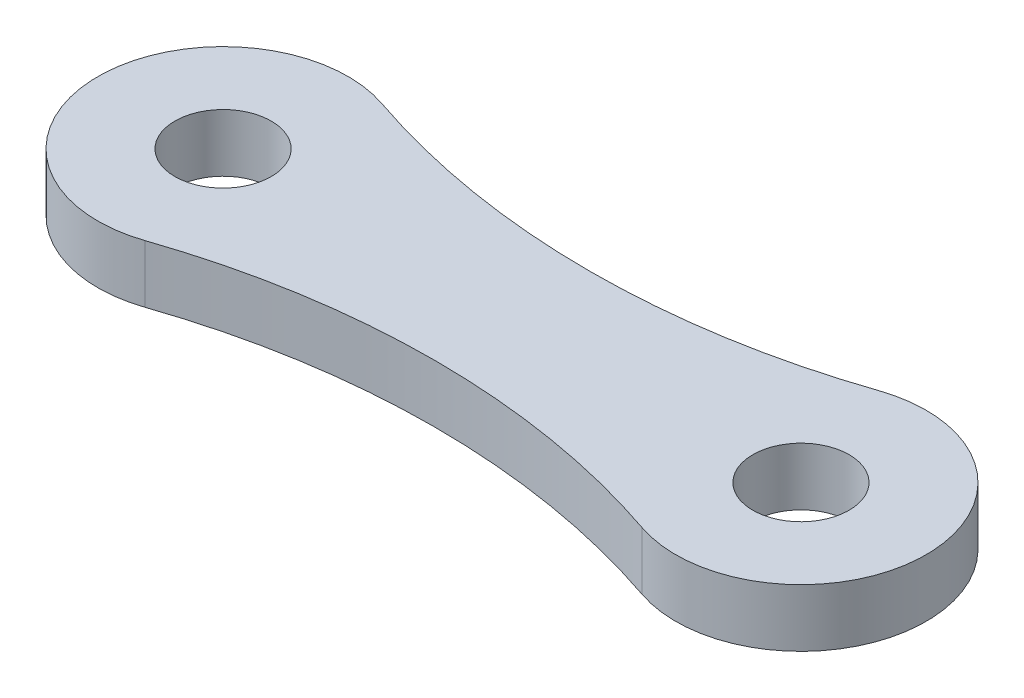
ISO-10303-21;
HEADER;
FILE_DESCRIPTION(('STEP AP214'),'2;1');
FILE_NAME('part.step','',(''),(''),'','','');
FILE_SCHEMA(('AUTOMOTIVE_DESIGN { 1 0 10303 214 1 1 1 1 }'));
ENDSEC;
DATA;
#1=APPLICATION_CONTEXT('core data for automotive mechanical design processes');
#2=APPLICATION_PROTOCOL_DEFINITION('international standard','automotive_design',2000,#1);
#3=PRODUCT_CONTEXT('',#1,'mechanical');
#4=PRODUCT('Part','Part','',(#3));
#5=PRODUCT_RELATED_PRODUCT_CATEGORY('part','',(#4));
#6=PRODUCT_DEFINITION_FORMATION('','',#4);
#7=PRODUCT_DEFINITION_CONTEXT('part definition',#1,'design');
#8=PRODUCT_DEFINITION('design','',#6,#7);
#9=PRODUCT_DEFINITION_SHAPE('','',#8);
#10=(LENGTH_UNIT() NAMED_UNIT(*) SI_UNIT(.MILLI.,.METRE.));
#11=(NAMED_UNIT(*) PLANE_ANGLE_UNIT() SI_UNIT($,.RADIAN.));
#12=(NAMED_UNIT(*) SI_UNIT($,.STERADIAN.) SOLID_ANGLE_UNIT());
#13=UNCERTAINTY_MEASURE_WITH_UNIT(LENGTH_MEASURE(1.E-05),#10,'distance_accuracy_value','');
#14=(GEOMETRIC_REPRESENTATION_CONTEXT(3) GLOBAL_UNCERTAINTY_ASSIGNED_CONTEXT((#13)) GLOBAL_UNIT_ASSIGNED_CONTEXT((#10,
#11,#12)) REPRESENTATION_CONTEXT('',''));
#15=CARTESIAN_POINT('',(0.,0.,0.));
#16=DIRECTION('',(0.,0.,1.));
#17=DIRECTION('',(1.,0.,0.));
#18=AXIS2_PLACEMENT_3D('',#15,#16,#17);
#19=CARTESIAN_POINT('',(7.49999999999954,3.,-22.0071011266819));
#20=DIRECTION('',(0.,1.,0.));
#21=DIRECTION('',(0.,0.,1.));
#22=AXIS2_PLACEMENT_3D('',#19,#20,#21);
#23=PLANE('',#22);
#24=CARTESIAN_POINT('',(-15.,3.,0.));
#25=DIRECTION('',(0.,1.,0.));
#26=DIRECTION('',(0.,0.,1.));
#27=AXIS2_PLACEMENT_3D('',#24,#25,#26);
#28=CIRCLE('',#27,2.5);
#29=CARTESIAN_POINT('',(-15.,3.,2.5));
#30=VERTEX_POINT('',#29);
#31=EDGE_CURVE('E104',#30,#30,#28,.T.);
#32=ORIENTED_EDGE('',*,*,#31,.F.);
#33=EDGE_LOOP('',(#32));
#34=FACE_BOUND('',#33,.T.);
#35=CARTESIAN_POINT('',(-9.16473674324677E-13,3.,-44.0142022533639));
#36=DIRECTION('',(0.,-1.,0.));
#37=DIRECTION('',(0.,0.,1.));
#38=AXIS2_PLACEMENT_3D('',#35,#36,#37);
#39=CIRCLE('',#38,40.0000000000001);
#40=CARTESIAN_POINT('',(12.9032258064513,3.,-6.1525228956316));
#41=VERTEX_POINT('',#40);
#42=CARTESIAN_POINT('',(-12.9032258064517,3.,-6.15252289563152));
#43=VERTEX_POINT('',#42);
#44=EDGE_CURVE('E89',#41,#43,#39,.T.);
#45=ORIENTED_EDGE('',*,*,#44,.T.);
#46=CARTESIAN_POINT('',(-15.,3.,0.));
#47=DIRECTION('',(0.,1.,0.));
#48=DIRECTION('',(0.,0.,1.));
#49=AXIS2_PLACEMENT_3D('',#46,#47,#48);
#50=CIRCLE('',#49,6.5);
#51=CARTESIAN_POINT('',(-12.9032258064517,3.,6.15252289563152));
#52=VERTEX_POINT('',#51);
#53=EDGE_CURVE('E84',#43,#52,#50,.T.);
#54=ORIENTED_EDGE('',*,*,#53,.T.);
#55=CARTESIAN_POINT('',(-9.16473674324677E-13,3.,44.0142022533639));
#56=DIRECTION('',(0.,-1.,0.));
#57=DIRECTION('',(0.,0.,-1.));
#58=AXIS2_PLACEMENT_3D('',#55,#56,#57);
#59=CIRCLE('',#58,40.0000000000001);
#60=CARTESIAN_POINT('',(12.9032258064512,3.,6.15252289563186));
#61=VERTEX_POINT('',#60);
#62=EDGE_CURVE('E87',#52,#61,#59,.T.);
#63=ORIENTED_EDGE('',*,*,#62,.T.);
#64=CARTESIAN_POINT('',(15.,3.,1.93890881133645E-13));
#65=DIRECTION('',(0.,1.,0.));
#66=DIRECTION('',(0.,0.,-1.));
#67=AXIS2_PLACEMENT_3D('',#64,#65,#66);
#68=CIRCLE('',#67,6.50000000000042);
#69=EDGE_CURVE('E54',#61,#41,#68,.T.);
#70=ORIENTED_EDGE('',*,*,#69,.T.);
#71=EDGE_LOOP('',(#45,#54,#63,#70));
#72=FACE_BOUND('',#71,.T.);
#73=CARTESIAN_POINT('',(15.,3.,1.93890881133645E-13));
#74=DIRECTION('',(0.,1.,0.));
#75=DIRECTION('',(0.,0.,-1.));
#76=AXIS2_PLACEMENT_3D('',#73,#74,#75);
#77=CIRCLE('',#76,2.5);
#78=CARTESIAN_POINT('',(15.,3.,-2.49999999999981));
#79=VERTEX_POINT('',#78);
#80=EDGE_CURVE('E119',#79,#79,#77,.T.);
#81=ORIENTED_EDGE('',*,*,#80,.F.);
#82=EDGE_LOOP('',(#81));
#83=FACE_BOUND('',#82,.T.);
#84=ADVANCED_FACE('F37',(#34,#72,#83),#23,.T.);
#85=CARTESIAN_POINT('',(7.49999999999954,0.,-22.0071011266819));
#86=DIRECTION('',(0.,1.,0.));
#87=DIRECTION('',(0.,0.,1.));
#88=AXIS2_PLACEMENT_3D('',#85,#86,#87);
#89=PLANE('',#88);
#90=CARTESIAN_POINT('',(-9.16473674324677E-13,0.,-44.0142022533639));
#91=DIRECTION('',(0.,-1.,0.));
#92=DIRECTION('',(0.,0.,1.));
#93=AXIS2_PLACEMENT_3D('',#90,#91,#92);
#94=CIRCLE('',#93,40.0000000000001);
#95=CARTESIAN_POINT('',(12.9032258064513,0.,-6.1525228956316));
#96=VERTEX_POINT('',#95);
#97=CARTESIAN_POINT('',(-12.9032258064517,0.,-6.15252289563152));
#98=VERTEX_POINT('',#97);
#99=EDGE_CURVE('E101',#96,#98,#94,.T.);
#100=ORIENTED_EDGE('',*,*,#99,.F.);
#101=CARTESIAN_POINT('',(15.,0.,1.93890881133645E-13));
#102=DIRECTION('',(0.,1.,0.));
#103=DIRECTION('',(0.,0.,-1.));
#104=AXIS2_PLACEMENT_3D('',#101,#102,#103);
#105=CIRCLE('',#104,6.50000000000042);
#106=CARTESIAN_POINT('',(12.9032258064512,0.,6.15252289563186));
#107=VERTEX_POINT('',#106);
#108=EDGE_CURVE('E77',#107,#96,#105,.T.);
#109=ORIENTED_EDGE('',*,*,#108,.F.);
#110=CARTESIAN_POINT('',(-9.16473674324677E-13,0.,44.0142022533639));
#111=DIRECTION('',(0.,-1.,0.));
#112=DIRECTION('',(0.,0.,-1.));
#113=AXIS2_PLACEMENT_3D('',#110,#111,#112);
#114=CIRCLE('',#113,40.0000000000001);
#115=CARTESIAN_POINT('',(-12.9032258064517,0.,6.15252289563152));
#116=VERTEX_POINT('',#115);
#117=EDGE_CURVE('E71',#116,#107,#114,.T.);
#118=ORIENTED_EDGE('',*,*,#117,.F.);
#119=CARTESIAN_POINT('',(-15.,0.,0.));
#120=DIRECTION('',(0.,1.,0.));
#121=DIRECTION('',(0.,0.,1.));
#122=AXIS2_PLACEMENT_3D('',#119,#120,#121);
#123=CIRCLE('',#122,6.5);
#124=EDGE_CURVE('E93',#98,#116,#123,.T.);
#125=ORIENTED_EDGE('',*,*,#124,.F.);
#126=EDGE_LOOP('',(#100,#109,#118,#125));
#127=FACE_BOUND('',#126,.T.);
#128=CARTESIAN_POINT('',(-15.,0.,0.));
#129=DIRECTION('',(0.,1.,0.));
#130=DIRECTION('',(0.,0.,1.));
#131=AXIS2_PLACEMENT_3D('',#128,#129,#130);
#132=CIRCLE('',#131,2.5);
#133=CARTESIAN_POINT('',(-15.,0.,2.5));
#134=VERTEX_POINT('',#133);
#135=EDGE_CURVE('E116',#134,#134,#132,.T.);
#136=ORIENTED_EDGE('',*,*,#135,.T.);
#137=EDGE_LOOP('',(#136));
#138=FACE_BOUND('',#137,.T.);
#139=CARTESIAN_POINT('',(15.,0.,1.93890881133645E-13));
#140=DIRECTION('',(0.,1.,0.));
#141=DIRECTION('',(0.,0.,-1.));
#142=AXIS2_PLACEMENT_3D('',#139,#140,#141);
#143=CIRCLE('',#142,2.5);
#144=CARTESIAN_POINT('',(15.,0.,-2.49999999999981));
#145=VERTEX_POINT('',#144);
#146=EDGE_CURVE('E122',#145,#145,#143,.T.);
#147=ORIENTED_EDGE('',*,*,#146,.T.);
#148=EDGE_LOOP('',(#147));
#149=FACE_BOUND('',#148,.T.);
#150=ADVANCED_FACE('F112',(#127,#138,#149),#89,.F.);
#151=CARTESIAN_POINT('',(-9.16473674324677E-13,3.,-44.0142022533639));
#152=DIRECTION('',(0.,-1.,0.));
#153=DIRECTION('',(0.,0.,-1.));
#154=AXIS2_PLACEMENT_3D('',#151,#152,#153);
#155=CYLINDRICAL_SURFACE('',#154,40.0000000000001);
#156=ORIENTED_EDGE('',*,*,#99,.T.);
#157=DIRECTION('',(0.,-1.,0.));
#158=VECTOR('',#157,1.);
#159=CARTESIAN_POINT('',(-12.9032258064517,3.,-6.15252289563152));
#160=LINE('',#159,#158);
#161=EDGE_CURVE('E11',#43,#98,#160,.T.);
#162=ORIENTED_EDGE('',*,*,#161,.F.);
#163=ORIENTED_EDGE('',*,*,#44,.F.);
#164=DIRECTION('',(0.,-1.,0.));
#165=VECTOR('',#164,1.);
#166=CARTESIAN_POINT('',(12.9032258064513,3.,-6.1525228956316));
#167=LINE('',#166,#165);
#168=EDGE_CURVE('E97',#41,#96,#167,.T.);
#169=ORIENTED_EDGE('',*,*,#168,.T.);
#170=EDGE_LOOP('',(#156,#162,#163,#169));
#171=FACE_BOUND('',#170,.T.);
#172=ADVANCED_FACE('F39',(#171),#155,.F.);
#173=CARTESIAN_POINT('',(-15.,3.,0.));
#174=DIRECTION('',(0.,-1.,0.));
#175=DIRECTION('',(0.,0.,-1.));
#176=AXIS2_PLACEMENT_3D('',#173,#174,#175);
#177=CYLINDRICAL_SURFACE('',#176,6.5);
#178=ORIENTED_EDGE('',*,*,#124,.T.);
#179=DIRECTION('',(0.,-1.,0.));
#180=VECTOR('',#179,1.);
#181=CARTESIAN_POINT('',(-12.9032258064517,3.,6.15252289563152));
#182=LINE('',#181,#180);
#183=EDGE_CURVE('E46',#52,#116,#182,.T.);
#184=ORIENTED_EDGE('',*,*,#183,.F.);
#185=ORIENTED_EDGE('',*,*,#53,.F.);
#186=ORIENTED_EDGE('',*,*,#161,.T.);
#187=EDGE_LOOP('',(#178,#184,#185,#186));
#188=FACE_BOUND('',#187,.T.);
#189=ADVANCED_FACE('F92',(#188),#177,.T.);
#190=CARTESIAN_POINT('',(-9.16473674324677E-13,3.,44.0142022533639));
#191=DIRECTION('',(0.,-1.,0.));
#192=DIRECTION('',(0.,0.,-1.));
#193=AXIS2_PLACEMENT_3D('',#190,#191,#192);
#194=CYLINDRICAL_SURFACE('',#193,40.0000000000001);
#195=ORIENTED_EDGE('',*,*,#117,.T.);
#196=DIRECTION('',(0.,-1.,0.));
#197=VECTOR('',#196,1.);
#198=CARTESIAN_POINT('',(12.9032258064512,3.,6.15252289563186));
#199=LINE('',#198,#197);
#200=EDGE_CURVE('E94',#61,#107,#199,.T.);
#201=ORIENTED_EDGE('',*,*,#200,.F.);
#202=ORIENTED_EDGE('',*,*,#62,.F.);
#203=ORIENTED_EDGE('',*,*,#183,.T.);
#204=EDGE_LOOP('',(#195,#201,#202,#203));
#205=FACE_BOUND('',#204,.T.);
#206=ADVANCED_FACE('F95',(#205),#194,.F.);
#207=CARTESIAN_POINT('',(15.,3.,1.93890881133645E-13));
#208=DIRECTION('',(0.,-1.,0.));
#209=DIRECTION('',(0.,0.,-1.));
#210=AXIS2_PLACEMENT_3D('',#207,#208,#209);
#211=CYLINDRICAL_SURFACE('',#210,6.50000000000042);
#212=ORIENTED_EDGE('',*,*,#108,.T.);
#213=ORIENTED_EDGE('',*,*,#168,.F.);
#214=ORIENTED_EDGE('',*,*,#69,.F.);
#215=ORIENTED_EDGE('',*,*,#200,.T.);
#216=EDGE_LOOP('',(#212,#213,#214,#215));
#217=FACE_BOUND('',#216,.T.);
#218=ADVANCED_FACE('F109',(#217),#211,.T.);
#219=CARTESIAN_POINT('',(-15.,3.,0.));
#220=DIRECTION('',(0.,-1.,0.));
#221=DIRECTION('',(0.,0.,-1.));
#222=AXIS2_PLACEMENT_3D('',#219,#220,#221);
#223=CYLINDRICAL_SURFACE('',#222,2.5);
#224=ORIENTED_EDGE('',*,*,#31,.T.);
#225=EDGE_LOOP('',(#224));
#226=FACE_BOUND('',#225,.T.);
#227=ORIENTED_EDGE('',*,*,#135,.F.);
#228=EDGE_LOOP('',(#227));
#229=FACE_BOUND('',#228,.T.);
#230=ADVANCED_FACE('F139',(#226,#229),#223,.F.);
#231=CARTESIAN_POINT('',(15.,3.,1.93890881133645E-13));
#232=DIRECTION('',(0.,-1.,0.));
#233=DIRECTION('',(0.,0.,-1.));
#234=AXIS2_PLACEMENT_3D('',#231,#232,#233);
#235=CYLINDRICAL_SURFACE('',#234,2.5);
#236=ORIENTED_EDGE('',*,*,#80,.T.);
#237=EDGE_LOOP('',(#236));
#238=FACE_BOUND('',#237,.T.);
#239=ORIENTED_EDGE('',*,*,#146,.F.);
#240=EDGE_LOOP('',(#239));
#241=FACE_BOUND('',#240,.T.);
#242=ADVANCED_FACE('F128',(#238,#241),#235,.F.);
#243=CLOSED_SHELL('',(#84,#150,#172,#189,#206,#218,#230,#242));
#244=MANIFOLD_SOLID_BREP('B2',#243);
#245=ADVANCED_BREP_SHAPE_REPRESENTATION('',(#18,#244),#14);
#246=SHAPE_DEFINITION_REPRESENTATION(#9,#245);
ENDSEC;
END-ISO-10303-21;
